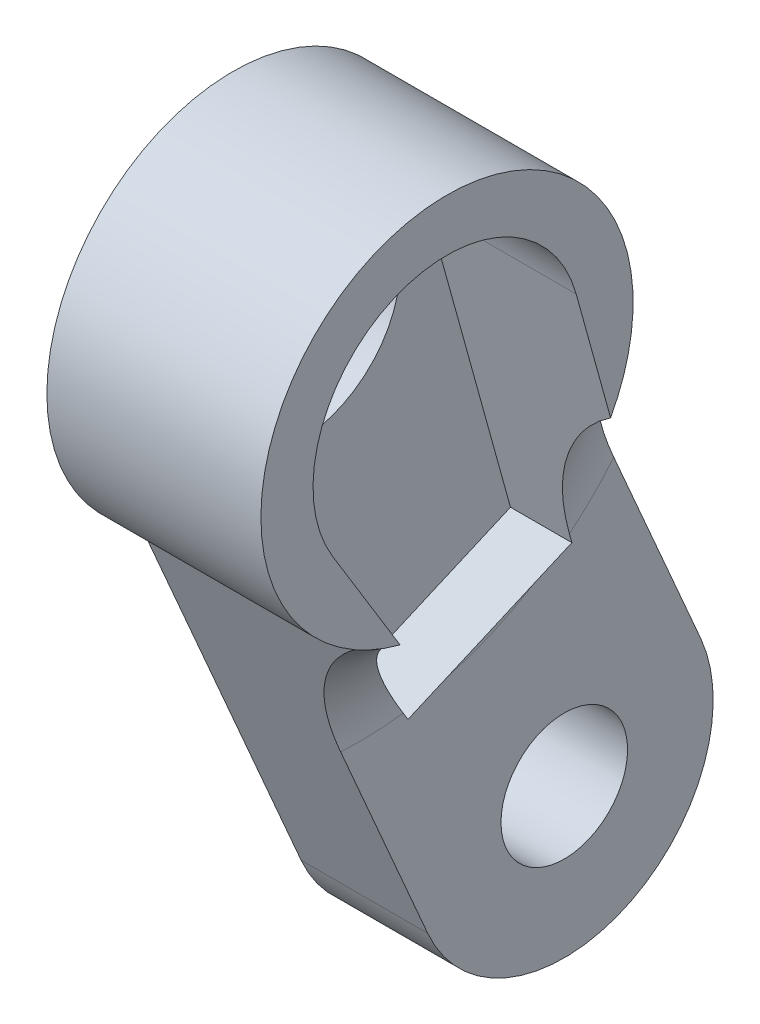
ISO-10303-21;
HEADER;
FILE_DESCRIPTION(('STEP AP214'),'2;1');
FILE_NAME('part.step','',(''),(''),'','','');
FILE_SCHEMA(('AUTOMOTIVE_DESIGN { 1 0 10303 214 1 1 1 1 }'));
ENDSEC;
DATA;
#1=APPLICATION_CONTEXT('core data for automotive mechanical design processes');
#2=APPLICATION_PROTOCOL_DEFINITION('international standard','automotive_design',2000,#1);
#3=PRODUCT_CONTEXT('',#1,'mechanical');
#4=PRODUCT('Part','Part','',(#3));
#5=PRODUCT_RELATED_PRODUCT_CATEGORY('part','',(#4));
#6=PRODUCT_DEFINITION_FORMATION('','',#4);
#7=PRODUCT_DEFINITION_CONTEXT('part definition',#1,'design');
#8=PRODUCT_DEFINITION('design','',#6,#7);
#9=PRODUCT_DEFINITION_SHAPE('','',#8);
#10=(LENGTH_UNIT() NAMED_UNIT(*) SI_UNIT(.MILLI.,.METRE.));
#11=(NAMED_UNIT(*) PLANE_ANGLE_UNIT() SI_UNIT($,.RADIAN.));
#12=(NAMED_UNIT(*) SI_UNIT($,.STERADIAN.) SOLID_ANGLE_UNIT());
#13=UNCERTAINTY_MEASURE_WITH_UNIT(LENGTH_MEASURE(1.E-05),#10,'distance_accuracy_value','');
#14=(GEOMETRIC_REPRESENTATION_CONTEXT(3) GLOBAL_UNCERTAINTY_ASSIGNED_CONTEXT((#13)) GLOBAL_UNIT_ASSIGNED_CONTEXT((#10,
#11,#12)) REPRESENTATION_CONTEXT('',''));
#15=CARTESIAN_POINT('',(0.,0.,0.));
#16=DIRECTION('',(0.,0.,1.));
#17=DIRECTION('',(1.,0.,0.));
#18=AXIS2_PLACEMENT_3D('',#15,#16,#17);
#19=CARTESIAN_POINT('',(-31.5963708891012,-52.7407828448025,-34.5));
#20=DIRECTION('',(1.,0.,0.));
#21=DIRECTION('',(0.,0.,-1.));
#22=AXIS2_PLACEMENT_3D('',#19,#20,#21);
#23=CYLINDRICAL_SURFACE('',#22,2.75000000000001);
#24=CARTESIAN_POINT('',(-37.3463708891012,-52.7407828448025,-34.5));
#25=DIRECTION('',(1.,0.,0.));
#26=DIRECTION('',(0.,0.,-1.));
#27=AXIS2_PLACEMENT_3D('',#24,#25,#26);
#28=CIRCLE('',#27,2.75000000000001);
#29=CARTESIAN_POINT('',(-37.3463708891012,-52.7407828448025,-37.25));
#30=VERTEX_POINT('',#29);
#31=EDGE_CURVE('E198',#30,#30,#28,.T.);
#32=ORIENTED_EDGE('',*,*,#31,.F.);
#33=EDGE_LOOP('',(#32));
#34=FACE_BOUND('',#33,.T.);
#35=CARTESIAN_POINT('',(-35.5963708891012,-52.7407828448025,-34.5));
#36=DIRECTION('',(1.,0.,0.));
#37=DIRECTION('',(0.,0.,-1.));
#38=AXIS2_PLACEMENT_3D('',#35,#36,#37);
#39=CIRCLE('',#38,2.75000000000001);
#40=CARTESIAN_POINT('',(-35.5963708891012,-52.7407828448025,-37.25));
#41=VERTEX_POINT('',#40);
#42=EDGE_CURVE('E47',#41,#41,#39,.F.);
#43=ORIENTED_EDGE('',*,*,#42,.F.);
#44=EDGE_LOOP('',(#43));
#45=FACE_BOUND('',#44,.T.);
#46=ADVANCED_FACE('F42',(#34,#45),#23,.F.);
#47=CARTESIAN_POINT('',(-29.5463708891012,-52.7407828448025,-34.5));
#48=DIRECTION('',(-1.,0.,0.));
#49=DIRECTION('',(0.,0.,1.));
#50=AXIS2_PLACEMENT_3D('',#47,#48,#49);
#51=TOROIDAL_SURFACE('',#50,8.89326341261415,4.4);
#52=CARTESIAN_POINT('',(-31.5963708891012,-52.7407828448025,-34.5));
#53=DIRECTION('',(1.,0.,0.));
#54=DIRECTION('',(0.,0.,-1.));
#55=AXIS2_PLACEMENT_3D('',#52,#53,#54);
#56=CIRCLE('',#55,5.);
#57=CARTESIAN_POINT('',(-31.5963708891012,-55.125195705239,-38.8948350721028));
#58=VERTEX_POINT('',#57);
#59=CARTESIAN_POINT('',(-31.5963708891012,-53.9008565037566,-39.3635613603409));
#60=VERTEX_POINT('',#59);
#61=EDGE_CURVE('E68',#58,#60,#56,.T.);
#62=ORIENTED_EDGE('',*,*,#61,.F.);
#63=CARTESIAN_POINT('',(-31.5961708891012,-55.1250494566148,-38.8947946140171));
#64=CARTESIAN_POINT('',(-31.6709881927947,-55.1797735748218,-38.909933444075));
#65=CARTESIAN_POINT('',(-31.7442456456962,-55.2364523544438,-38.9256130098808));
#66=CARTESIAN_POINT('',(-31.8876139201358,-55.3533604204122,-38.9579543504284));
#67=CARTESIAN_POINT('',(-31.9577255765105,-55.4135887548382,-38.9746158618319));
#68=CARTESIAN_POINT('',(-32.094776047434,-55.5372313022583,-39.0088202231749));
#69=CARTESIAN_POINT('',(-32.1617166552242,-55.6006436718398,-39.0263625631544));
#70=CARTESIAN_POINT('',(-32.2924333348549,-55.7304278974135,-39.06226595273));
#71=CARTESIAN_POINT('',(-32.3562091471538,-55.7967999952852,-39.0806270692393));
#72=CARTESIAN_POINT('',(-32.5430416325494,-56.0003808104403,-39.1369454799269));
#73=CARTESIAN_POINT('',(-32.6612709644708,-56.1417524393971,-39.1760543981866));
#74=CARTESIAN_POINT('',(-32.8841498531081,-56.4341028413213,-39.256929946247));
#75=CARTESIAN_POINT('',(-32.9887978240559,-56.5850827330938,-39.2986968855527));
#76=CARTESIAN_POINT('',(-33.173071895537,-56.878684674512,-39.3799186583551));
#77=CARTESIAN_POINT('',(-33.2541802262645,-57.0204434569443,-39.4191346783986));
#78=CARTESIAN_POINT('',(-33.4041335101128,-57.3098504119505,-39.499195953993));
#79=CARTESIAN_POINT('',(-33.4729800272561,-57.4574978304706,-39.5400410009432));
#80=CARTESIAN_POINT('',(-33.5974451103539,-57.757409364417,-39.6230082536574));
#81=CARTESIAN_POINT('',(-33.6531012205193,-57.9096589511193,-39.6651264402084));
#82=CARTESIAN_POINT('',(-33.7506425773046,-58.2182018043498,-39.7504814532026));
#83=CARTESIAN_POINT('',(-33.7925262296213,-58.3744955367719,-39.7937184085303));
#84=CARTESIAN_POINT('',(-33.8748006726639,-58.749695436694,-39.8975133660151));
#85=CARTESIAN_POINT('',(-33.9086744557678,-58.9699904204555,-39.9584555690338));
#86=CARTESIAN_POINT('',(-33.9374355063491,-59.3022734318432,-40.0503780376886));
#87=CARTESIAN_POINT('',(-33.9433416435905,-59.4134700694782,-40.0811393739208));
#88=CARTESIAN_POINT('',(-33.9476020077557,-59.6360479632075,-40.142713119067));
#89=CARTESIAN_POINT('',(-33.9459527080176,-59.7474292812531,-40.1735255451192));
#90=CARTESIAN_POINT('',(-33.9404424761543,-59.8586776372782,-40.2043011886796));
#91=B_SPLINE_CURVE_WITH_KNOTS('',3,(#63,#64,#65,#66,#67,#68,#69,#70,#71,#72,#73,#74,#75,#76,#77,
#78,#79,#80,#81,#82,#83,#84,#85,#86,#87,#88,#89,#90),.UNSPECIFIED.,.F.,.F.,(4,2,2,2,2,2,2,2,2,2,
2,2,2,4),(0.,0.281709746012697,0.56334428382487,0.844817606906529,1.12631397529773,
1.69067105539099,2.25509397099814,2.75844567940159,3.26173313808625,3.76357039337378,
4.26546572103692,4.95659557488056,5.302957675501,5.64948146450878),.UNSPECIFIED.);
#92=CARTESIAN_POINT('',(-33.9463708891012,-59.6186001795878,-40.1378863801489));
#93=VERTEX_POINT('',#92);
#94=EDGE_CURVE('E11',#58,#93,#91,.T.);
#95=ORIENTED_EDGE('',*,*,#94,.T.);
#96=CARTESIAN_POINT('',(-33.9463708891012,-52.7407828448025,-34.5));
#97=DIRECTION('',(-1.,0.,0.));
#98=DIRECTION('',(0.,0.,1.));
#99=AXIS2_PLACEMENT_3D('',#96,#97,#98);
#100=CIRCLE('',#99,8.89326341261415);
#101=CARTESIAN_POINT('',(-33.9463708891012,-58.4353948223743,-41.3309244287313));
#102=VERTEX_POINT('',#101);
#103=EDGE_CURVE('E256',#102,#93,#100,.T.);
#104=ORIENTED_EDGE('',*,*,#103,.F.);
#105=CARTESIAN_POINT('',(-31.5963708891012,-53.9008565037566,-39.3635613603409));
#106=CARTESIAN_POINT('',(-31.6661653894167,-53.9570676875207,-39.3879492470887));
#107=CARTESIAN_POINT('',(-31.7345884421252,-54.0146962544449,-39.4129520822804));
#108=CARTESIAN_POINT('',(-31.8687223215499,-54.1325334011888,-39.4640771217661));
#109=CARTESIAN_POINT('',(-31.9344335931423,-54.1927415544897,-39.4901991410097));
#110=CARTESIAN_POINT('',(-32.0631821032264,-54.3154870785796,-39.5434537380463));
#111=CARTESIAN_POINT('',(-32.1262199792452,-54.3780238872954,-39.570586071977));
#112=CARTESIAN_POINT('',(-32.2496290574018,-54.5052731020858,-39.6257946484781));
#113=CARTESIAN_POINT('',(-32.31000011147,-54.5699856286122,-39.6538709433078));
#114=CARTESIAN_POINT('',(-32.4880475158139,-54.7682736310646,-39.7399005378374));
#115=CARTESIAN_POINT('',(-32.6016067724257,-54.9049939516303,-39.7992182655706));
#116=CARTESIAN_POINT('',(-32.8171722401954,-55.1859045313648,-39.9210946422286));
#117=CARTESIAN_POINT('',(-32.9191766407385,-55.3300959560906,-39.983653796844));
#118=CARTESIAN_POINT('',(-33.118034248368,-55.636510750296,-40.1165954785259));
#119=CARTESIAN_POINT('',(-33.2139077039795,-55.7992718700727,-40.1872113149175));
#120=CARTESIAN_POINT('',(-33.3899406595554,-56.1318366971919,-40.3314984975913));
#121=CARTESIAN_POINT('',(-33.470098450587,-56.3016411680037,-40.4051701751138));
#122=CARTESIAN_POINT('',(-33.6128912166231,-56.646448463194,-40.5547688973219));
#123=CARTESIAN_POINT('',(-33.6756071775935,-56.8214229423816,-40.6306836441113));
#124=CARTESIAN_POINT('',(-33.7825076927836,-57.1759921403882,-40.7845176832863));
#125=CARTESIAN_POINT('',(-33.8267042769577,-57.3555837792246,-40.8624356393851));
#126=CARTESIAN_POINT('',(-33.8889661841932,-57.6849899256958,-41.0053523911099));
#127=CARTESIAN_POINT('',(-33.9103211637383,-57.8342830890666,-41.0701249953622));
#128=CARTESIAN_POINT('',(-33.9390388562125,-58.1341599637424,-41.2002301233483));
#129=CARTESIAN_POINT('',(-33.9463857460233,-58.2847449416876,-41.2655631966289));
#130=CARTESIAN_POINT('',(-33.9463708891012,-58.4353948223743,-41.3309244287313));
#131=B_SPLINE_CURVE_WITH_KNOTS('',3,(#105,#106,#107,#108,#109,#110,#111,#112,#113,#114,#115,
#116,#117,#118,#119,#120,#121,#122,#123,#124,#125,#126,#127,#128,#129,#130),.UNSPECIFIED.,.F.,
.F.,(4,2,2,2,2,2,2,2,2,2,2,2,4),(0.,0.278584655286986,0.557123424726445,0.835595392924999,
1.11408280330434,1.67560240090995,2.23720986576821,2.8414745700391,3.44580494609784,
4.047280573664,4.64836488224771,5.1401872885537,5.63256491434224),.UNSPECIFIED.);
#132=EDGE_CURVE('E270',#60,#102,#131,.T.);
#133=ORIENTED_EDGE('',*,*,#132,.F.);
#134=EDGE_LOOP('',(#62,#95,#104,#133));
#135=FACE_BOUND('',#134,.T.);
#136=ADVANCED_FACE('F300',(#135),#51,.F.);
#137=CARTESIAN_POINT('',(-33.9463708891012,-60.3024339779443,-39.180979199569));
#138=VERTEX_POINT('',#137);
#139=CARTESIAN_POINT('',(-33.9463708891012,-61.3249960700917,-36.8240949698562));
#140=VERTEX_POINT('',#139);
#141=EDGE_CURVE('E261',#138,#140,#100,.T.);
#142=ORIENTED_EDGE('',*,*,#141,.F.);
#143=CARTESIAN_POINT('',(-33.9404494009013,-59.8583908649133,-40.2044458608623));
#144=CARTESIAN_POINT('',(-33.9429526146245,-59.932381887937,-40.033905336581));
#145=CARTESIAN_POINT('',(-33.9444341432917,-60.0063758166731,-39.8633581149778));
#146=CARTESIAN_POINT('',(-33.94614441976,-60.1543648216716,-39.5222610268593));
#147=CARTESIAN_POINT('',(-33.9463731929469,-60.2283598978803,-39.3517111604678));
#148=CARTESIAN_POINT('',(-33.9463685850899,-60.3763488130456,-39.0106142794042));
#149=CARTESIAN_POINT('',(-33.946135208542,-60.4503426520072,-38.8400672647206));
#150=CARTESIAN_POINT('',(-33.9456964391533,-60.598330676704,-38.4989724360812));
#151=CARTESIAN_POINT('',(-33.945491046402,-60.6723248624396,-38.3284246221246));
#152=CARTESIAN_POINT('',(-33.9453421465969,-60.8203129769066,-37.9873295865755));
#153=CARTESIAN_POINT('',(-33.9453986384637,-60.8943069056378,-37.8167823649834));
#154=CARTESIAN_POINT('',(-33.9457126409931,-61.0422945606357,-37.475688388456));
#155=CARTESIAN_POINT('',(-33.9459701514793,-61.1162882869025,-37.3051416335203));
#156=CARTESIAN_POINT('',(-33.9463601389198,-61.2642762490902,-36.9640469489569));
#157=CARTESIAN_POINT('',(-33.9464926154369,-61.338270485012,-36.7934990193271));
#158=CARTESIAN_POINT('',(-33.9459816608254,-61.4862588097802,-36.4524034990587));
#159=CARTESIAN_POINT('',(-33.9453382248991,-61.5602528986229,-36.2818559084287));
#160=CARTESIAN_POINT('',(-33.9439813896165,-61.6342462574167,-36.1113100004749));
#161=B_SPLINE_CURVE_WITH_KNOTS('',3,(#143,#144,#145,#146,#147,#148,#149,#150,#151,#152,#153,
#154,#155,#156,#157,#158,#159,#160),.UNSPECIFIED.,.F.,.F.,(4,2,2,2,2,2,2,2,4),(0.,
0.557738376754869,1.11546545151447,1.67318710056011,2.23091053541807,2.78863167180567,
3.34635231880258,3.90407491623603,4.46180096217093),.UNSPECIFIED.);
#162=EDGE_CURVE('E53',#138,#140,#161,.T.);
#163=ORIENTED_EDGE('',*,*,#162,.T.);
#164=EDGE_LOOP('',(#142,#163));
#165=FACE_BOUND('',#164,.T.);
#166=ADVANCED_FACE('F295',(#165),#51,.F.);
#167=CARTESIAN_POINT('',(-37.3463708891012,-65.4176299164527,-40.));
#168=DIRECTION('',(1.,0.,0.));
#169=DIRECTION('',(0.,0.,-1.));
#170=AXIS2_PLACEMENT_3D('',#167,#168,#169);
#171=CYLINDRICAL_SURFACE('',#170,3.99999999999997);
#172=CARTESIAN_POINT('',(-33.9463708891012,-65.4176299164527,-40.));
#173=DIRECTION('',(1.,0.,0.));
#174=DIRECTION('',(0.,0.,-1.));
#175=AXIS2_PLACEMENT_3D('',#172,#173,#174);
#176=CIRCLE('',#175,4.);
#177=CARTESIAN_POINT('',(-33.9463708891012,-67.0096922276857,-36.3304853730839));
#178=VERTEX_POINT('',#177);
#179=CARTESIAN_POINT('',(-33.9463708891012,-63.8255676052197,-43.6695146269162));
#180=VERTEX_POINT('',#179);
#181=EDGE_CURVE('E213',#178,#180,#176,.T.);
#182=ORIENTED_EDGE('',*,*,#181,.F.);
#183=DIRECTION('',(1.,0.,0.));
#184=VECTOR('',#183,1.);
#185=CARTESIAN_POINT('',(-37.3463708891012,-67.0096922276857,-36.3304853730839));
#186=LINE('',#185,#184);
#187=CARTESIAN_POINT('',(-37.3463708891012,-67.0096922276857,-36.3304853730839));
#188=VERTEX_POINT('',#187);
#189=EDGE_CURVE('E242',#188,#178,#186,.T.);
#190=ORIENTED_EDGE('',*,*,#189,.F.);
#191=CARTESIAN_POINT('',(-37.3463708891012,-65.4176299164527,-40.));
#192=DIRECTION('',(1.,0.,0.));
#193=DIRECTION('',(0.,0.,-1.));
#194=AXIS2_PLACEMENT_3D('',#191,#192,#193);
#195=CIRCLE('',#194,3.99999999999997);
#196=CARTESIAN_POINT('',(-37.3463708891012,-63.8255676052197,-43.6695146269161));
#197=VERTEX_POINT('',#196);
#198=EDGE_CURVE('E221',#188,#197,#195,.T.);
#199=ORIENTED_EDGE('',*,*,#198,.T.);
#200=DIRECTION('',(1.,0.,0.));
#201=VECTOR('',#200,1.);
#202=CARTESIAN_POINT('',(-37.3463708891012,-63.8255676052197,-43.6695146269161));
#203=LINE('',#202,#201);
#204=EDGE_CURVE('E238',#197,#180,#203,.T.);
#205=ORIENTED_EDGE('',*,*,#204,.T.);
#206=EDGE_LOOP('',(#182,#190,#199,#205));
#207=FACE_BOUND('',#206,.T.);
#208=ADVANCED_FACE('F283',(#207),#171,.T.);
#209=CARTESIAN_POINT('',(-37.3463708891012,-57.0849811262226,-32.0245321065086));
#210=DIRECTION('',(0.,-0.398015577808251,0.917378656729033));
#211=DIRECTION('',(0.,-0.917378656729033,-0.398015577808251));
#212=AXIS2_PLACEMENT_3D('',#209,#210,#211);
#213=PLANE('',#212);
#214=DIRECTION('',(0.,-0.917378656729033,-0.398015577808251));
#215=VECTOR('',#214,1.);
#216=CARTESIAN_POINT('',(-33.9463708891012,-57.0849811262226,-32.0245321065086));
#217=LINE('',#216,#215);
#218=CARTESIAN_POINT('',(-33.9463708891012,-61.6195194448403,-33.991895174899));
#219=VERTEX_POINT('',#218);
#220=EDGE_CURVE('E210',#219,#178,#217,.T.);
#221=ORIENTED_EDGE('',*,*,#220,.F.);
#222=CARTESIAN_POINT('',(-33.9463708891012,-61.6195194448403,-33.991895174899));
#223=CARTESIAN_POINT('',(-33.9464000270806,-61.4464789136747,-33.916819494327));
#224=CARTESIAN_POINT('',(-33.9366992512286,-61.2735276732321,-33.8417825535911));
#225=CARTESIAN_POINT('',(-33.8989314491493,-60.9295049647379,-33.6925242335985));
#226=CARTESIAN_POINT('',(-33.8708851779232,-60.7584315942957,-33.6183020289671));
#227=CARTESIAN_POINT('',(-33.7977261147609,-60.4204427284442,-33.4716615629525));
#228=CARTESIAN_POINT('',(-33.7527123878216,-60.2535089807088,-33.3992353825817));
#229=CARTESIAN_POINT('',(-33.6467773067534,-59.9239275689903,-33.2562425899569));
#230=CARTESIAN_POINT('',(-33.5858527249422,-59.7612807820406,-33.1856763582143));
#231=CARTESIAN_POINT('',(-33.4560719552421,-59.4571580040557,-33.0537290948718));
#232=CARTESIAN_POINT('',(-33.3886014368663,-59.3151820402198,-32.9921311441602));
#233=CARTESIAN_POINT('',(-33.2426089686383,-59.036167265222,-32.8710772848043));
#234=CARTESIAN_POINT('',(-33.1640881162835,-58.8991279654559,-32.8116211641732));
#235=CARTESIAN_POINT('',(-32.9129158278124,-58.4957721885129,-32.6366204908474));
#236=CARTESIAN_POINT('',(-32.7247132389089,-58.237352625278,-32.5245021076439));
#237=CARTESIAN_POINT('',(-32.4496084116153,-57.9099285164737,-32.3824452863976));
#238=CARTESIAN_POINT('',(-32.3785830912145,-57.829256824306,-32.3474449188446));
#239=CARTESIAN_POINT('',(-32.2325511439057,-57.6710059349644,-32.2787858992587));
#240=CARTESIAN_POINT('',(-32.157545478133,-57.5934259990743,-32.2451269267253));
#241=CARTESIAN_POINT('',(-32.0038347982747,-57.4418452226242,-32.1793618144885));
#242=CARTESIAN_POINT('',(-31.9251414769552,-57.3678344033258,-32.1472513453915));
#243=CARTESIAN_POINT('',(-31.763760767994,-57.2235188507847,-32.0846383364556));
#244=CARTESIAN_POINT('',(-31.6810718644073,-57.1532155456879,-32.0541364162347));
#245=CARTESIAN_POINT('',(-31.5963708891012,-57.0849811262226,-32.0245321065086));
#246=B_SPLINE_CURVE_WITH_KNOTS('',3,(#222,#223,#224,#225,#226,#227,#228,#229,#230,#231,#232,
#233,#234,#235,#236,#237,#238,#239,#240,#241,#242,#243,#244,#245),.UNSPECIFIED.,.F.,.F.,(4,2,2,
2,2,2,2,2,2,2,2,4),(0.,0.565483675600225,1.13032870057289,1.69192569699826,2.25363670782911,
2.75964514376066,3.26560335934748,4.27799035865486,4.61704651893849,4.95602117650207,
5.29398547475532,5.63207902097743),.UNSPECIFIED.);
#247=CARTESIAN_POINT('',(-31.5963708891012,-57.0849811262226,-32.0245321065086));
#248=VERTEX_POINT('',#247);
#249=EDGE_CURVE('E260',#219,#248,#246,.T.);
#250=ORIENTED_EDGE('',*,*,#249,.T.);
#251=DIRECTION('',(1.,0.,0.));
#252=VECTOR('',#251,1.);
#253=CARTESIAN_POINT('',(-37.3463708891012,-57.0849811262226,-32.0245321065086));
#254=LINE('',#253,#252);
#255=CARTESIAN_POINT('',(-37.3463708891012,-57.0849811262226,-32.0245321065086));
#256=VERTEX_POINT('',#255);
#257=EDGE_CURVE('E247',#256,#248,#254,.T.);
#258=ORIENTED_EDGE('',*,*,#257,.F.);
#259=DIRECTION('',(0.,-0.917378656729033,-0.398015577808251));
#260=VECTOR('',#259,1.);
#261=CARTESIAN_POINT('',(-37.3463708891012,-57.0849811262226,-32.0245321065086));
#262=LINE('',#261,#260);
#263=EDGE_CURVE('E234',#256,#188,#262,.T.);
#264=ORIENTED_EDGE('',*,*,#263,.T.);
#265=ORIENTED_EDGE('',*,*,#189,.T.);
#266=EDGE_LOOP('',(#221,#250,#258,#264,#265));
#267=FACE_BOUND('',#266,.T.);
#268=ADVANCED_FACE('F277',(#267),#213,.T.);
#269=CARTESIAN_POINT('',(-37.3463708891012,-52.7407828448025,-34.5));
#270=DIRECTION('',(1.,0.,0.));
#271=DIRECTION('',(0.,0.,-1.));
#272=AXIS2_PLACEMENT_3D('',#269,#270,#271);
#273=CYLINDRICAL_SURFACE('',#272,5.);
#274=ORIENTED_EDGE('',*,*,#257,.T.);
#275=EDGE_CURVE('E220',#60,#248,#56,.T.);
#276=ORIENTED_EDGE('',*,*,#275,.F.);
#277=DIRECTION('',(1.,0.,0.));
#278=VECTOR('',#277,1.);
#279=CARTESIAN_POINT('',(-37.3463708891012,-53.9008565037566,-39.3635613603409));
#280=LINE('',#279,#278);
#281=CARTESIAN_POINT('',(-37.3463708891012,-53.9008565037566,-39.3635613603409));
#282=VERTEX_POINT('',#281);
#283=EDGE_CURVE('E250',#282,#60,#280,.T.);
#284=ORIENTED_EDGE('',*,*,#283,.F.);
#285=CARTESIAN_POINT('',(-37.3463708891012,-52.7407828448025,-34.5));
#286=DIRECTION('',(1.,0.,0.));
#287=DIRECTION('',(0.,0.,-1.));
#288=AXIS2_PLACEMENT_3D('',#285,#286,#287);
#289=CIRCLE('',#288,5.);
#290=EDGE_CURVE('E230',#282,#256,#289,.T.);
#291=ORIENTED_EDGE('',*,*,#290,.T.);
#292=EDGE_LOOP('',(#274,#276,#284,#291));
#293=FACE_BOUND('',#292,.T.);
#294=ADVANCED_FACE('F282',(#293),#273,.T.);
#295=CARTESIAN_POINT('',(-37.3463708891012,-63.8255676052197,-43.6695146269161));
#296=DIRECTION('',(0.,0.398015577808244,-0.917378656729036));
#297=DIRECTION('',(0.,0.917378656729036,0.398015577808244));
#298=AXIS2_PLACEMENT_3D('',#295,#296,#297);
#299=PLANE('',#298);
#300=DIRECTION('',(0.,0.917378656729033,0.39801557780825));
#301=VECTOR('',#300,1.);
#302=CARTESIAN_POINT('',(-33.9463708891012,-63.8255676052197,-43.6695146269162));
#303=LINE('',#302,#301);
#304=EDGE_CURVE('E216',#180,#102,#303,.T.);
#305=ORIENTED_EDGE('',*,*,#304,.F.);
#306=ORIENTED_EDGE('',*,*,#204,.F.);
#307=DIRECTION('',(0.,0.917378656729036,0.398015577808244));
#308=VECTOR('',#307,1.);
#309=CARTESIAN_POINT('',(-37.3463708891012,-63.8255676052197,-43.6695146269161));
#310=LINE('',#309,#308);
#311=EDGE_CURVE('E225',#197,#282,#310,.T.);
#312=ORIENTED_EDGE('',*,*,#311,.T.);
#313=ORIENTED_EDGE('',*,*,#283,.T.);
#314=ORIENTED_EDGE('',*,*,#132,.T.);
#315=EDGE_LOOP('',(#305,#306,#312,#313,#314));
#316=FACE_BOUND('',#315,.T.);
#317=ADVANCED_FACE('F288',(#316),#299,.T.);
#318=CARTESIAN_POINT('',(-37.3463708891012,-65.4176299164527,-40.));
#319=DIRECTION('',(1.,0.,0.));
#320=DIRECTION('',(0.,0.,-1.));
#321=AXIS2_PLACEMENT_3D('',#318,#319,#320);
#322=PLANE('',#321);
#323=ORIENTED_EDGE('',*,*,#31,.T.);
#324=EDGE_LOOP('',(#323));
#325=FACE_BOUND('',#324,.T.);
#326=CARTESIAN_POINT('',(-37.3463708891012,-65.4176299164527,-40.));
#327=DIRECTION('',(-1.,0.,0.));
#328=DIRECTION('',(0.,0.,1.));
#329=AXIS2_PLACEMENT_3D('',#326,#327,#328);
#330=CIRCLE('',#329,1.70000000000001);
#331=CARTESIAN_POINT('',(-37.3463708891012,-65.4176299164527,-38.3));
#332=VERTEX_POINT('',#331);
#333=EDGE_CURVE('E202',#332,#332,#330,.T.);
#334=ORIENTED_EDGE('',*,*,#333,.F.);
#335=EDGE_LOOP('',(#334));
#336=FACE_BOUND('',#335,.T.);
#337=ORIENTED_EDGE('',*,*,#198,.F.);
#338=ORIENTED_EDGE('',*,*,#263,.F.);
#339=ORIENTED_EDGE('',*,*,#290,.F.);
#340=ORIENTED_EDGE('',*,*,#311,.F.);
#341=EDGE_LOOP('',(#337,#338,#339,#340));
#342=FACE_BOUND('',#341,.T.);
#343=ADVANCED_FACE('F292',(#325,#336,#342),#322,.F.);
#344=CARTESIAN_POINT('',(-31.5963708891012,-65.4176299164527,-40.));
#345=DIRECTION('',(1.,0.,0.));
#346=DIRECTION('',(0.,0.,-1.));
#347=AXIS2_PLACEMENT_3D('',#344,#345,#346);
#348=PLANE('',#347);
#349=DIRECTION('',(0.,0.963800386468016,0.266624858263634));
#350=VECTOR('',#349,1.);
#351=CARTESIAN_POINT('',(-31.5963708891012,-51.7809333550534,-37.9696813912849));
#352=LINE('',#351,#350);
#353=CARTESIAN_POINT('',(-31.5963708891012,-51.7809333550534,-37.9696813912849));
#354=VERTEX_POINT('',#353);
#355=EDGE_CURVE('E163',#58,#354,#352,.T.);
#356=ORIENTED_EDGE('',*,*,#355,.F.);
#357=ORIENTED_EDGE('',*,*,#61,.T.);
#358=ORIENTED_EDGE('',*,*,#275,.T.);
#359=CARTESIAN_POINT('',(-31.5963708891012,-57.5791165168431,-33.2388389167129));
#360=VERTEX_POINT('',#359);
#361=EDGE_CURVE('E226',#248,#360,#56,.T.);
#362=ORIENTED_EDGE('',*,*,#361,.T.);
#363=DIRECTION('',(0.,-0.853142811219113,-0.52167743258181));
#364=VECTOR('',#363,1.);
#365=CARTESIAN_POINT('',(-31.5963708891012,-61.7689524107578,-35.8008283085629));
#366=LINE('',#365,#364);
#367=CARTESIAN_POINT('',(-31.5963708891012,-54.618821602097,-31.4286858796112));
#368=VERTEX_POINT('',#367);
#369=EDGE_CURVE('E60',#368,#360,#366,.T.);
#370=ORIENTED_EDGE('',*,*,#369,.F.);
#371=CARTESIAN_POINT('',(-31.5963708891012,-52.7407828448025,-34.5));
#372=DIRECTION('',(1.,0.,0.));
#373=DIRECTION('',(0.,0.,-1.));
#374=AXIS2_PLACEMENT_3D('',#371,#372,#373);
#375=CIRCLE('',#374,3.60000000000001);
#376=EDGE_CURVE('E144',#354,#368,#375,.T.);
#377=ORIENTED_EDGE('',*,*,#376,.F.);
#378=EDGE_LOOP('',(#356,#357,#358,#362,#370,#377));
#379=FACE_BOUND('',#378,.T.);
#380=ADVANCED_FACE('F285',(#379),#348,.T.);
#381=CARTESIAN_POINT('',(-33.9463708891012,-52.7407828448025,-34.5));
#382=DIRECTION('',(-1.,0.,0.));
#383=DIRECTION('',(0.,0.,1.));
#384=AXIS2_PLACEMENT_3D('',#381,#382,#383);
#385=PLANE('',#384);
#386=CARTESIAN_POINT('',(-33.9463708891012,-65.4176299164527,-40.));
#387=DIRECTION('',(-1.,0.,0.));
#388=DIRECTION('',(0.,0.,1.));
#389=AXIS2_PLACEMENT_3D('',#386,#387,#388);
#390=CIRCLE('',#389,1.70000000000001);
#391=CARTESIAN_POINT('',(-33.9463708891012,-65.4176299164527,-38.3));
#392=VERTEX_POINT('',#391);
#393=EDGE_CURVE('E206',#392,#392,#390,.T.);
#394=ORIENTED_EDGE('',*,*,#393,.T.);
#395=EDGE_LOOP('',(#394));
#396=FACE_BOUND('',#395,.T.);
#397=ORIENTED_EDGE('',*,*,#103,.T.);
#398=DIRECTION('',(0.,-0.963800386468016,-0.266624858263634));
#399=VECTOR('',#398,1.);
#400=CARTESIAN_POINT('',(-33.9463708891012,-51.7809333550534,-37.9696813912849));
#401=LINE('',#400,#399);
#402=CARTESIAN_POINT('',(-33.9463708891012,-59.8584776372782,-40.2042458608623));
#403=VERTEX_POINT('',#402);
#404=EDGE_CURVE('E194',#93,#403,#401,.T.);
#405=ORIENTED_EDGE('',*,*,#404,.T.);
#406=DIRECTION('',(0.,-0.39801557780825,0.917378656729033));
#407=VECTOR('',#406,1.);
#408=CARTESIAN_POINT('',(-33.9463708891012,-60.813715024018,-38.0025370847126));
#409=LINE('',#408,#407);
#410=EDGE_CURVE('E193',#403,#138,#409,.T.);
#411=ORIENTED_EDGE('',*,*,#410,.T.);
#412=ORIENTED_EDGE('',*,*,#141,.T.);
#413=CARTESIAN_POINT('',(-33.9463708891012,-61.7689524107578,-35.8008283085629));
#414=VERTEX_POINT('',#413);
#415=EDGE_CURVE('E189',#140,#414,#409,.T.);
#416=ORIENTED_EDGE('',*,*,#415,.T.);
#417=DIRECTION('',(0.,0.853142811219113,0.52167743258181));
#418=VECTOR('',#417,1.);
#419=CARTESIAN_POINT('',(-33.9463708891012,-54.618821602097,-31.4286858796112));
#420=LINE('',#419,#418);
#421=CARTESIAN_POINT('',(-33.9463708891012,-61.5566161931391,-35.6709895390219));
#422=VERTEX_POINT('',#421);
#423=EDGE_CURVE('E179',#414,#422,#420,.T.);
#424=ORIENTED_EDGE('',*,*,#423,.T.);
#425=EDGE_CURVE('E246',#422,#219,#100,.T.);
#426=ORIENTED_EDGE('',*,*,#425,.T.);
#427=ORIENTED_EDGE('',*,*,#220,.T.);
#428=ORIENTED_EDGE('',*,*,#181,.T.);
#429=ORIENTED_EDGE('',*,*,#304,.T.);
#430=EDGE_LOOP('',(#397,#405,#411,#412,#416,#424,#426,#427,#428,#429));
#431=FACE_BOUND('',#430,.T.);
#432=ADVANCED_FACE('F318',(#396,#431),#385,.F.);
#433=CARTESIAN_POINT('',(-37.3463708891012,-65.4176299164527,-40.));
#434=DIRECTION('',(-1.,0.,0.));
#435=DIRECTION('',(0.,0.,1.));
#436=AXIS2_PLACEMENT_3D('',#433,#434,#435);
#437=CYLINDRICAL_SURFACE('',#436,1.70000000000001);
#438=ORIENTED_EDGE('',*,*,#333,.T.);
#439=EDGE_LOOP('',(#438));
#440=FACE_BOUND('',#439,.T.);
#441=ORIENTED_EDGE('',*,*,#393,.F.);
#442=EDGE_LOOP('',(#441));
#443=FACE_BOUND('',#442,.T.);
#444=ADVANCED_FACE('F315',(#440,#443),#437,.F.);
#445=ORIENTED_EDGE('',*,*,#425,.F.);
#446=CARTESIAN_POINT('',(-33.9455826857159,-61.6342462574167,-35.7184585583829));
#447=CARTESIAN_POINT('',(-33.9483415327021,-61.499349945192,-35.635972530369));
#448=CARTESIAN_POINT('',(-33.9439005737603,-61.3643865832666,-35.5534455029874));
#449=CARTESIAN_POINT('',(-33.9211505745175,-61.0953966239004,-35.388964258409));
#450=CARTESIAN_POINT('',(-33.9028506148874,-60.961369471046,-35.3070097015894));
#451=CARTESIAN_POINT('',(-33.852998441213,-60.6955811170664,-35.1444861659153));
#452=CARTESIAN_POINT('',(-33.8214899823703,-60.5638139161139,-35.063913518303));
#453=CARTESIAN_POINT('',(-33.7458563260784,-60.3029553098293,-34.904404411265));
#454=CARTESIAN_POINT('',(-33.7017291736156,-60.1738643224492,-34.8254682074075));
#455=CARTESIAN_POINT('',(-33.5516736079951,-59.792531396026,-34.5922917926276));
#456=CARTESIAN_POINT('',(-33.4278834759589,-59.5452668691396,-34.4410951560758));
#457=CARTESIAN_POINT('',(-33.1377999837906,-59.0694076974852,-34.1501180914219));
#458=CARTESIAN_POINT('',(-32.9714656856975,-58.8408313164568,-34.0103488311812));
#459=CARTESIAN_POINT('',(-32.7020805928192,-58.5256544757691,-33.8176253587484));
#460=CARTESIAN_POINT('',(-32.6139425359051,-58.4295671348144,-33.7588701343315));
#461=CARTESIAN_POINT('',(-32.4301218904509,-58.2428056851839,-33.6446697539646));
#462=CARTESIAN_POINT('',(-32.3344412563762,-58.1521301847994,-33.5892237470164));
#463=CARTESIAN_POINT('',(-32.1358937723269,-57.9769582702324,-33.4821101038491));
#464=CARTESIAN_POINT('',(-32.0330388015643,-57.8924520945474,-33.430436498693));
#465=CARTESIAN_POINT('',(-31.8733311440604,-57.7708460998432,-33.3560771976831));
#466=CARTESIAN_POINT('',(-31.8191696198661,-57.7311556592088,-33.3318073956102));
#467=CARTESIAN_POINT('',(-31.7090317418387,-57.6536376322575,-33.284406884527));
#468=CARTESIAN_POINT('',(-31.6530551032859,-57.6158103405621,-33.261276355671));
#469=CARTESIAN_POINT('',(-31.5961708891012,-57.5789870595777,-33.2387597565383));
#470=B_SPLINE_CURVE_WITH_KNOTS('',3,(#446,#447,#448,#449,#450,#451,#452,#453,#454,#455,#456,
#457,#458,#459,#460,#461,#462,#463,#464,#465,#466,#467,#468,#469),.UNSPECIFIED.,.F.,.F.,(4,2,2,
2,2,2,2,2,2,2,2,4),(0.,0.474190452872655,0.948070476000192,1.42039295039794,1.89278864137596,
2.83418908860018,3.77649882526212,4.20527528783228,4.63394100690862,5.06191306308142,
5.27606058203253,5.49024185632385),.UNSPECIFIED.);
#471=EDGE_CURVE('E344',#422,#360,#470,.T.);
#472=ORIENTED_EDGE('',*,*,#471,.T.);
#473=ORIENTED_EDGE('',*,*,#361,.F.);
#474=ORIENTED_EDGE('',*,*,#249,.F.);
#475=EDGE_LOOP('',(#445,#472,#473,#474));
#476=FACE_BOUND('',#475,.T.);
#477=ADVANCED_FACE('F44',(#476),#51,.F.);
#478=CARTESIAN_POINT('',(-35.5963708891012,-52.7407828448025,-34.5));
#479=DIRECTION('',(1.,0.,0.));
#480=DIRECTION('',(0.,0.,-1.));
#481=AXIS2_PLACEMENT_3D('',#478,#479,#480);
#482=PLANE('',#481);
#483=CARTESIAN_POINT('',(-35.5963708891012,-52.7407828448025,-34.5));
#484=DIRECTION('',(1.,0.,0.));
#485=DIRECTION('',(0.,0.,-1.));
#486=AXIS2_PLACEMENT_3D('',#483,#484,#485);
#487=CIRCLE('',#486,3.60000000000001);
#488=CARTESIAN_POINT('',(-35.5963708891012,-51.7809333550534,-37.9696813912849));
#489=VERTEX_POINT('',#488);
#490=CARTESIAN_POINT('',(-35.5963708891012,-54.618821602097,-31.4286858796112));
#491=VERTEX_POINT('',#490);
#492=EDGE_CURVE('E141',#489,#491,#487,.T.);
#493=ORIENTED_EDGE('',*,*,#492,.T.);
#494=DIRECTION('',(0.,-0.853142811219113,-0.52167743258181));
#495=VECTOR('',#494,1.);
#496=CARTESIAN_POINT('',(-35.5963708891012,-61.7689524107578,-35.8008283085629));
#497=LINE('',#496,#495);
#498=CARTESIAN_POINT('',(-35.5963708891012,-61.7689524107578,-35.8008283085629));
#499=VERTEX_POINT('',#498);
#500=EDGE_CURVE('E150',#491,#499,#497,.T.);
#501=ORIENTED_EDGE('',*,*,#500,.T.);
#502=DIRECTION('',(0.,0.39801557780825,-0.917378656729033));
#503=VECTOR('',#502,1.);
#504=CARTESIAN_POINT('',(-35.5963708891012,-59.8584776372782,-40.2042458608623));
#505=LINE('',#504,#503);
#506=CARTESIAN_POINT('',(-35.5963708891012,-59.8584776372782,-40.2042458608623));
#507=VERTEX_POINT('',#506);
#508=EDGE_CURVE('E157',#499,#507,#505,.T.);
#509=ORIENTED_EDGE('',*,*,#508,.T.);
#510=DIRECTION('',(0.,0.963800386468016,0.266624858263634));
#511=VECTOR('',#510,1.);
#512=CARTESIAN_POINT('',(-35.5963708891012,-51.7809333550534,-37.9696813912849));
#513=LINE('',#512,#511);
#514=EDGE_CURVE('E147',#507,#489,#513,.T.);
#515=ORIENTED_EDGE('',*,*,#514,.T.);
#516=EDGE_LOOP('',(#493,#501,#509,#515));
#517=FACE_BOUND('',#516,.T.);
#518=ORIENTED_EDGE('',*,*,#42,.T.);
#519=EDGE_LOOP('',(#518));
#520=FACE_BOUND('',#519,.T.);
#521=ADVANCED_FACE('F159',(#517,#520),#482,.T.);
#522=CARTESIAN_POINT('',(-35.5963708891012,-51.7809333550534,-37.9696813912849));
#523=DIRECTION('',(0.,0.266624858263634,-0.963800386468016));
#524=DIRECTION('',(0.,0.963800386468016,0.266624858263634));
#525=AXIS2_PLACEMENT_3D('',#522,#523,#524);
#526=PLANE('',#525);
#527=ORIENTED_EDGE('',*,*,#94,.F.);
#528=ORIENTED_EDGE('',*,*,#355,.T.);
#529=DIRECTION('',(1.,0.,0.));
#530=VECTOR('',#529,1.);
#531=CARTESIAN_POINT('',(-35.5963708891012,-51.7809333550534,-37.9696813912849));
#532=LINE('',#531,#530);
#533=EDGE_CURVE('E176',#489,#354,#532,.T.);
#534=ORIENTED_EDGE('',*,*,#533,.F.);
#535=ORIENTED_EDGE('',*,*,#514,.F.);
#536=DIRECTION('',(1.,0.,0.));
#537=VECTOR('',#536,1.);
#538=CARTESIAN_POINT('',(-35.5963708891012,-59.8584776372782,-40.2042458608623));
#539=LINE('',#538,#537);
#540=EDGE_CURVE('E180',#507,#403,#539,.T.);
#541=ORIENTED_EDGE('',*,*,#540,.T.);
#542=ORIENTED_EDGE('',*,*,#404,.F.);
#543=EDGE_LOOP('',(#527,#528,#534,#535,#541,#542));
#544=FACE_BOUND('',#543,.T.);
#545=ADVANCED_FACE('F373',(#544),#526,.F.);
#546=CARTESIAN_POINT('',(-35.5963708891012,-59.8584776372782,-40.2042458608623));
#547=DIRECTION('',(0.,-0.917378656729033,-0.39801557780825));
#548=DIRECTION('',(0.,0.39801557780825,-0.917378656729033));
#549=AXIS2_PLACEMENT_3D('',#546,#547,#548);
#550=PLANE('',#549);
#551=ORIENTED_EDGE('',*,*,#540,.F.);
#552=ORIENTED_EDGE('',*,*,#508,.F.);
#553=DIRECTION('',(1.,0.,0.));
#554=VECTOR('',#553,1.);
#555=CARTESIAN_POINT('',(-35.5963708891012,-61.7689524107578,-35.8008283085629));
#556=LINE('',#555,#554);
#557=EDGE_CURVE('E146',#499,#414,#556,.T.);
#558=ORIENTED_EDGE('',*,*,#557,.T.);
#559=ORIENTED_EDGE('',*,*,#415,.F.);
#560=ORIENTED_EDGE('',*,*,#162,.F.);
#561=ORIENTED_EDGE('',*,*,#410,.F.);
#562=EDGE_LOOP('',(#551,#552,#558,#559,#560,#561));
#563=FACE_BOUND('',#562,.T.);
#564=ADVANCED_FACE('F370',(#563),#550,.F.);
#565=CARTESIAN_POINT('',(-35.5963708891012,-61.7689524107578,-35.8008283085629));
#566=DIRECTION('',(0.,-0.52167743258181,0.853142811219113));
#567=DIRECTION('',(0.,-0.853142811219113,-0.52167743258181));
#568=AXIS2_PLACEMENT_3D('',#565,#566,#567);
#569=PLANE('',#568);
#570=ORIENTED_EDGE('',*,*,#557,.F.);
#571=ORIENTED_EDGE('',*,*,#500,.F.);
#572=DIRECTION('',(1.,0.,0.));
#573=VECTOR('',#572,1.);
#574=CARTESIAN_POINT('',(-35.5963708891012,-54.618821602097,-31.4286858796112));
#575=LINE('',#574,#573);
#576=EDGE_CURVE('E136',#491,#368,#575,.T.);
#577=ORIENTED_EDGE('',*,*,#576,.T.);
#578=ORIENTED_EDGE('',*,*,#369,.T.);
#579=ORIENTED_EDGE('',*,*,#471,.F.);
#580=ORIENTED_EDGE('',*,*,#423,.F.);
#581=EDGE_LOOP('',(#570,#571,#577,#578,#579,#580));
#582=FACE_BOUND('',#581,.T.);
#583=ADVANCED_FACE('F151',(#582),#569,.F.);
#584=CARTESIAN_POINT('',(-35.5963708891012,-52.7407828448025,-34.5));
#585=DIRECTION('',(1.,0.,0.));
#586=DIRECTION('',(0.,0.,-1.));
#587=AXIS2_PLACEMENT_3D('',#584,#585,#586);
#588=CYLINDRICAL_SURFACE('',#587,3.60000000000001);
#589=ORIENTED_EDGE('',*,*,#376,.T.);
#590=ORIENTED_EDGE('',*,*,#576,.F.);
#591=ORIENTED_EDGE('',*,*,#492,.F.);
#592=ORIENTED_EDGE('',*,*,#533,.T.);
#593=EDGE_LOOP('',(#589,#590,#591,#592));
#594=FACE_BOUND('',#593,.T.);
#595=ADVANCED_FACE('F138',(#594),#588,.F.);
#596=CLOSED_SHELL('',(#46,#136,#166,#208,#268,#294,#317,#343,#380,#432,#444,#477,#521,#545,#564,
#583,#595));
#597=MANIFOLD_SOLID_BREP('B2',#596);
#598=ADVANCED_BREP_SHAPE_REPRESENTATION('',(#18,#597),#14);
#599=SHAPE_DEFINITION_REPRESENTATION(#9,#598);
ENDSEC;
END-ISO-10303-21;
